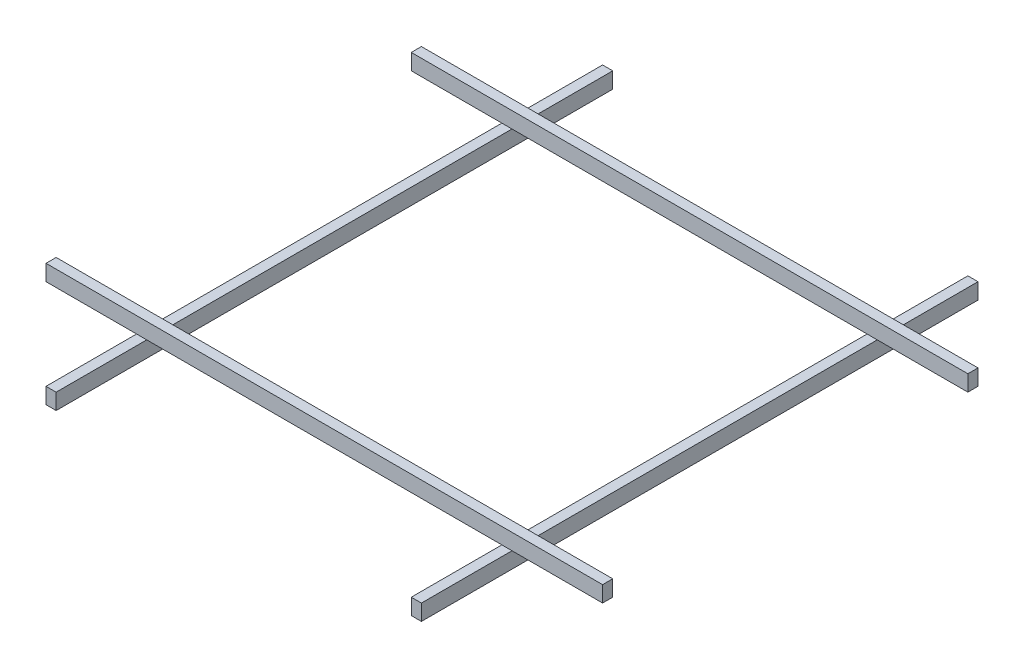
ISO-10303-21;
HEADER;
FILE_DESCRIPTION(('STEP AP214'),'2;1');
FILE_NAME('part.step','',(''),(''),'','','');
FILE_SCHEMA(('AUTOMOTIVE_DESIGN { 1 0 10303 214 1 1 1 1 }'));
ENDSEC;
DATA;
#1=APPLICATION_CONTEXT('core data for automotive mechanical design processes');
#2=APPLICATION_PROTOCOL_DEFINITION('international standard','automotive_design',2000,#1);
#3=PRODUCT_CONTEXT('',#1,'mechanical');
#4=PRODUCT('Part','Part','',(#3));
#5=PRODUCT_RELATED_PRODUCT_CATEGORY('part','',(#4));
#6=PRODUCT_DEFINITION_FORMATION('','',#4);
#7=PRODUCT_DEFINITION_CONTEXT('part definition',#1,'design');
#8=PRODUCT_DEFINITION('design','',#6,#7);
#9=PRODUCT_DEFINITION_SHAPE('','',#8);
#10=(LENGTH_UNIT() NAMED_UNIT(*) SI_UNIT(.MILLI.,.METRE.));
#11=(NAMED_UNIT(*) PLANE_ANGLE_UNIT() SI_UNIT($,.RADIAN.));
#12=(NAMED_UNIT(*) SI_UNIT($,.STERADIAN.) SOLID_ANGLE_UNIT());
#13=UNCERTAINTY_MEASURE_WITH_UNIT(LENGTH_MEASURE(1.E-05),#10,'distance_accuracy_value','');
#14=(GEOMETRIC_REPRESENTATION_CONTEXT(3) GLOBAL_UNCERTAINTY_ASSIGNED_CONTEXT((#13)) GLOBAL_UNIT_ASSIGNED_CONTEXT((#10,
#11,#12)) REPRESENTATION_CONTEXT('',''));
#15=CARTESIAN_POINT('',(0.,0.,0.));
#16=DIRECTION('',(0.,0.,1.));
#17=DIRECTION('',(1.,0.,0.));
#18=AXIS2_PLACEMENT_3D('',#15,#16,#17);
#19=CARTESIAN_POINT('',(4572.,209.55,-882.649999999999));
#20=DIRECTION('',(0.,0.,1.));
#21=DIRECTION('',(1.,0.,0.));
#22=AXIS2_PLACEMENT_3D('',#19,#20,#21);
#23=PLANE('',#22);
#24=DIRECTION('',(0.,1.,0.));
#25=VECTOR('',#24,1.);
#26=CARTESIAN_POINT('',(-304.8,209.55,-882.649999999999));
#27=LINE('',#26,#25);
#28=CARTESIAN_POINT('',(-304.8,69.85,-882.649999999999));
#29=VERTEX_POINT('',#28);
#30=CARTESIAN_POINT('',(-304.8,209.55,-882.649999999999));
#31=VERTEX_POINT('',#30);
#32=EDGE_CURVE('E126',#29,#31,#27,.T.);
#33=ORIENTED_EDGE('',*,*,#32,.T.);
#34=DIRECTION('',(-1.,0.,0.));
#35=VECTOR('',#34,1.);
#36=CARTESIAN_POINT('',(4572.,209.55,-882.649999999999));
#37=LINE('',#36,#35);
#38=CARTESIAN_POINT('',(4572.,209.55,-882.649999999999));
#39=VERTEX_POINT('',#38);
#40=EDGE_CURVE('E13',#39,#31,#37,.T.);
#41=ORIENTED_EDGE('',*,*,#40,.F.);
#42=DIRECTION('',(0.,1.,0.));
#43=VECTOR('',#42,1.);
#44=CARTESIAN_POINT('',(4572.,209.55,-882.649999999999));
#45=LINE('',#44,#43);
#46=CARTESIAN_POINT('',(4572.,69.85,-882.649999999999));
#47=VERTEX_POINT('',#46);
#48=EDGE_CURVE('E114',#47,#39,#45,.T.);
#49=ORIENTED_EDGE('',*,*,#48,.F.);
#50=DIRECTION('',(-1.,0.,0.));
#51=VECTOR('',#50,1.);
#52=CARTESIAN_POINT('',(4572.,69.85,-882.649999999999));
#53=LINE('',#52,#51);
#54=EDGE_CURVE('E122',#47,#29,#53,.T.);
#55=ORIENTED_EDGE('',*,*,#54,.T.);
#56=EDGE_LOOP('',(#33,#41,#49,#55));
#57=FACE_BOUND('',#56,.T.);
#58=ADVANCED_FACE('F63',(#57),#23,.F.);
#59=CARTESIAN_POINT('',(4572.,209.55,-793.749999999999));
#60=DIRECTION('',(0.,-1.,0.));
#61=DIRECTION('',(0.,0.,-1.));
#62=AXIS2_PLACEMENT_3D('',#59,#60,#61);
#63=PLANE('',#62);
#64=DIRECTION('',(0.,0.,1.));
#65=VECTOR('',#64,1.);
#66=CARTESIAN_POINT('',(-304.8,209.55,-793.749999999999));
#67=LINE('',#66,#65);
#68=CARTESIAN_POINT('',(-304.8,209.55,-793.749999999999));
#69=VERTEX_POINT('',#68);
#70=EDGE_CURVE('E118',#31,#69,#67,.T.);
#71=ORIENTED_EDGE('',*,*,#70,.T.);
#72=DIRECTION('',(-1.,0.,0.));
#73=VECTOR('',#72,1.);
#74=CARTESIAN_POINT('',(4572.,209.55,-793.749999999999));
#75=LINE('',#74,#73);
#76=CARTESIAN_POINT('',(4572.,209.55,-793.749999999999));
#77=VERTEX_POINT('',#76);
#78=EDGE_CURVE('E71',#77,#69,#75,.T.);
#79=ORIENTED_EDGE('',*,*,#78,.F.);
#80=DIRECTION('',(0.,0.,1.));
#81=VECTOR('',#80,1.);
#82=CARTESIAN_POINT('',(4572.,209.55,-793.749999999999));
#83=LINE('',#82,#81);
#84=EDGE_CURVE('E109',#39,#77,#83,.T.);
#85=ORIENTED_EDGE('',*,*,#84,.F.);
#86=ORIENTED_EDGE('',*,*,#40,.T.);
#87=EDGE_LOOP('',(#71,#79,#85,#86));
#88=FACE_BOUND('',#87,.T.);
#89=ADVANCED_FACE('F117',(#88),#63,.F.);
#90=CARTESIAN_POINT('',(4572.,209.55,-793.749999999999));
#91=DIRECTION('',(0.,0.,-1.));
#92=DIRECTION('',(-1.,0.,0.));
#93=AXIS2_PLACEMENT_3D('',#90,#91,#92);
#94=PLANE('',#93);
#95=DIRECTION('',(0.,-1.,0.));
#96=VECTOR('',#95,1.);
#97=CARTESIAN_POINT('',(-304.8,209.55,-793.749999999999));
#98=LINE('',#97,#96);
#99=CARTESIAN_POINT('',(-304.8,69.85,-793.749999999999));
#100=VERTEX_POINT('',#99);
#101=EDGE_CURVE('E96',#69,#100,#98,.T.);
#102=ORIENTED_EDGE('',*,*,#101,.T.);
#103=DIRECTION('',(-1.,0.,0.));
#104=VECTOR('',#103,1.);
#105=CARTESIAN_POINT('',(4572.,69.85,-793.749999999999));
#106=LINE('',#105,#104);
#107=CARTESIAN_POINT('',(4572.,69.85,-793.749999999999));
#108=VERTEX_POINT('',#107);
#109=EDGE_CURVE('E119',#108,#100,#106,.T.);
#110=ORIENTED_EDGE('',*,*,#109,.F.);
#111=DIRECTION('',(0.,-1.,0.));
#112=VECTOR('',#111,1.);
#113=CARTESIAN_POINT('',(4572.,209.55,-793.749999999999));
#114=LINE('',#113,#112);
#115=EDGE_CURVE('E112',#77,#108,#114,.T.);
#116=ORIENTED_EDGE('',*,*,#115,.F.);
#117=ORIENTED_EDGE('',*,*,#78,.T.);
#118=EDGE_LOOP('',(#102,#110,#116,#117));
#119=FACE_BOUND('',#118,.T.);
#120=ADVANCED_FACE('F120',(#119),#94,.F.);
#121=CARTESIAN_POINT('',(4572.,69.85,-793.749999999999));
#122=DIRECTION('',(0.,1.,0.));
#123=DIRECTION('',(0.,0.,1.));
#124=AXIS2_PLACEMENT_3D('',#121,#122,#123);
#125=PLANE('',#124);
#126=DIRECTION('',(0.,0.,-1.));
#127=VECTOR('',#126,1.);
#128=CARTESIAN_POINT('',(-304.8,69.85,-793.749999999999));
#129=LINE('',#128,#127);
#130=EDGE_CURVE('E102',#100,#29,#129,.T.);
#131=ORIENTED_EDGE('',*,*,#130,.T.);
#132=ORIENTED_EDGE('',*,*,#54,.F.);
#133=DIRECTION('',(0.,0.,-1.));
#134=VECTOR('',#133,1.);
#135=CARTESIAN_POINT('',(4572.,69.85,-793.749999999999));
#136=LINE('',#135,#134);
#137=EDGE_CURVE('E79',#108,#47,#136,.T.);
#138=ORIENTED_EDGE('',*,*,#137,.F.);
#139=ORIENTED_EDGE('',*,*,#109,.T.);
#140=EDGE_LOOP('',(#131,#132,#138,#139));
#141=FACE_BOUND('',#140,.T.);
#142=ADVANCED_FACE('F133',(#141),#125,.F.);
#143=CARTESIAN_POINT('',(4572.,139.7,-1371.6));
#144=DIRECTION('',(1.,0.,0.));
#145=DIRECTION('',(0.,0.,-1.));
#146=AXIS2_PLACEMENT_3D('',#143,#144,#145);
#147=PLANE('',#146);
#148=ORIENTED_EDGE('',*,*,#48,.T.);
#149=ORIENTED_EDGE('',*,*,#84,.T.);
#150=ORIENTED_EDGE('',*,*,#115,.T.);
#151=ORIENTED_EDGE('',*,*,#137,.T.);
#152=EDGE_LOOP('',(#148,#149,#150,#151));
#153=FACE_BOUND('',#152,.T.);
#154=ADVANCED_FACE('F110',(#153),#147,.T.);
#155=CARTESIAN_POINT('',(-304.8,139.7,-1371.6));
#156=DIRECTION('',(1.,0.,0.));
#157=DIRECTION('',(0.,0.,-1.));
#158=AXIS2_PLACEMENT_3D('',#155,#156,#157);
#159=PLANE('',#158);
#160=ORIENTED_EDGE('',*,*,#32,.F.);
#161=ORIENTED_EDGE('',*,*,#130,.F.);
#162=ORIENTED_EDGE('',*,*,#101,.F.);
#163=ORIENTED_EDGE('',*,*,#70,.F.);
#164=EDGE_LOOP('',(#160,#161,#162,#163));
#165=FACE_BOUND('',#164,.T.);
#166=ADVANCED_FACE('F136',(#165),#159,.F.);
#167=CLOSED_SHELL('',(#58,#89,#120,#142,#154,#166));
#168=MANIFOLD_SOLID_BREP('B2',#167);
#169=CARTESIAN_POINT('',(4572.,209.55,-4083.05));
#170=DIRECTION('',(0.,0.,1.));
#171=DIRECTION('',(1.,0.,0.));
#172=AXIS2_PLACEMENT_3D('',#169,#170,#171);
#173=PLANE('',#172);
#174=DIRECTION('',(0.,1.,0.));
#175=VECTOR('',#174,1.);
#176=CARTESIAN_POINT('',(-304.8,209.55,-4083.05));
#177=LINE('',#176,#175);
#178=CARTESIAN_POINT('',(-304.8,69.85,-4083.05));
#179=VERTEX_POINT('',#178);
#180=CARTESIAN_POINT('',(-304.8,209.55,-4083.05));
#181=VERTEX_POINT('',#180);
#182=EDGE_CURVE('E283',#179,#181,#177,.T.);
#183=ORIENTED_EDGE('',*,*,#182,.T.);
#184=DIRECTION('',(-1.,0.,0.));
#185=VECTOR('',#184,1.);
#186=CARTESIAN_POINT('',(4572.,209.55,-4083.05));
#187=LINE('',#186,#185);
#188=CARTESIAN_POINT('',(4572.,209.55,-4083.05));
#189=VERTEX_POINT('',#188);
#190=EDGE_CURVE('E61',#189,#181,#187,.T.);
#191=ORIENTED_EDGE('',*,*,#190,.F.);
#192=DIRECTION('',(0.,1.,0.));
#193=VECTOR('',#192,1.);
#194=CARTESIAN_POINT('',(4572.,209.55,-4083.05));
#195=LINE('',#194,#193);
#196=CARTESIAN_POINT('',(4572.,69.85,-4083.05));
#197=VERTEX_POINT('',#196);
#198=EDGE_CURVE('E271',#197,#189,#195,.T.);
#199=ORIENTED_EDGE('',*,*,#198,.F.);
#200=DIRECTION('',(-1.,0.,0.));
#201=VECTOR('',#200,1.);
#202=CARTESIAN_POINT('',(4572.,69.85,-4083.05));
#203=LINE('',#202,#201);
#204=EDGE_CURVE('E279',#197,#179,#203,.T.);
#205=ORIENTED_EDGE('',*,*,#204,.T.);
#206=EDGE_LOOP('',(#183,#191,#199,#205));
#207=FACE_BOUND('',#206,.T.);
#208=ADVANCED_FACE('F220',(#207),#173,.F.);
#209=CARTESIAN_POINT('',(4572.,209.55,-3994.15));
#210=DIRECTION('',(0.,-1.,0.));
#211=DIRECTION('',(0.,0.,-1.));
#212=AXIS2_PLACEMENT_3D('',#209,#210,#211);
#213=PLANE('',#212);
#214=DIRECTION('',(0.,0.,1.));
#215=VECTOR('',#214,1.);
#216=CARTESIAN_POINT('',(-304.8,209.55,-3994.15));
#217=LINE('',#216,#215);
#218=CARTESIAN_POINT('',(-304.8,209.55,-3994.15));
#219=VERTEX_POINT('',#218);
#220=EDGE_CURVE('E275',#181,#219,#217,.T.);
#221=ORIENTED_EDGE('',*,*,#220,.T.);
#222=DIRECTION('',(-1.,0.,0.));
#223=VECTOR('',#222,1.);
#224=CARTESIAN_POINT('',(4572.,209.55,-3994.15));
#225=LINE('',#224,#223);
#226=CARTESIAN_POINT('',(4572.,209.55,-3994.15));
#227=VERTEX_POINT('',#226);
#228=EDGE_CURVE('E228',#227,#219,#225,.T.);
#229=ORIENTED_EDGE('',*,*,#228,.F.);
#230=DIRECTION('',(0.,0.,1.));
#231=VECTOR('',#230,1.);
#232=CARTESIAN_POINT('',(4572.,209.55,-3994.15));
#233=LINE('',#232,#231);
#234=EDGE_CURVE('E266',#189,#227,#233,.T.);
#235=ORIENTED_EDGE('',*,*,#234,.F.);
#236=ORIENTED_EDGE('',*,*,#190,.T.);
#237=EDGE_LOOP('',(#221,#229,#235,#236));
#238=FACE_BOUND('',#237,.T.);
#239=ADVANCED_FACE('F274',(#238),#213,.F.);
#240=CARTESIAN_POINT('',(4572.,209.55,-3994.15));
#241=DIRECTION('',(0.,0.,-1.));
#242=DIRECTION('',(-1.,0.,0.));
#243=AXIS2_PLACEMENT_3D('',#240,#241,#242);
#244=PLANE('',#243);
#245=DIRECTION('',(0.,-1.,0.));
#246=VECTOR('',#245,1.);
#247=CARTESIAN_POINT('',(-304.8,209.55,-3994.15));
#248=LINE('',#247,#246);
#249=CARTESIAN_POINT('',(-304.8,69.85,-3994.15));
#250=VERTEX_POINT('',#249);
#251=EDGE_CURVE('E253',#219,#250,#248,.T.);
#252=ORIENTED_EDGE('',*,*,#251,.T.);
#253=DIRECTION('',(-1.,0.,0.));
#254=VECTOR('',#253,1.);
#255=CARTESIAN_POINT('',(4572.,69.85,-3994.15));
#256=LINE('',#255,#254);
#257=CARTESIAN_POINT('',(4572.,69.85,-3994.15));
#258=VERTEX_POINT('',#257);
#259=EDGE_CURVE('E276',#258,#250,#256,.T.);
#260=ORIENTED_EDGE('',*,*,#259,.F.);
#261=DIRECTION('',(0.,-1.,0.));
#262=VECTOR('',#261,1.);
#263=CARTESIAN_POINT('',(4572.,209.55,-3994.15));
#264=LINE('',#263,#262);
#265=EDGE_CURVE('E269',#227,#258,#264,.T.);
#266=ORIENTED_EDGE('',*,*,#265,.F.);
#267=ORIENTED_EDGE('',*,*,#228,.T.);
#268=EDGE_LOOP('',(#252,#260,#266,#267));
#269=FACE_BOUND('',#268,.T.);
#270=ADVANCED_FACE('F277',(#269),#244,.F.);
#271=CARTESIAN_POINT('',(4572.,69.85,-3994.15));
#272=DIRECTION('',(0.,1.,0.));
#273=DIRECTION('',(0.,0.,1.));
#274=AXIS2_PLACEMENT_3D('',#271,#272,#273);
#275=PLANE('',#274);
#276=DIRECTION('',(0.,0.,-1.));
#277=VECTOR('',#276,1.);
#278=CARTESIAN_POINT('',(-304.8,69.85,-3994.15));
#279=LINE('',#278,#277);
#280=EDGE_CURVE('E259',#250,#179,#279,.T.);
#281=ORIENTED_EDGE('',*,*,#280,.T.);
#282=ORIENTED_EDGE('',*,*,#204,.F.);
#283=DIRECTION('',(0.,0.,-1.));
#284=VECTOR('',#283,1.);
#285=CARTESIAN_POINT('',(4572.,69.85,-3994.15));
#286=LINE('',#285,#284);
#287=EDGE_CURVE('E236',#258,#197,#286,.T.);
#288=ORIENTED_EDGE('',*,*,#287,.F.);
#289=ORIENTED_EDGE('',*,*,#259,.T.);
#290=EDGE_LOOP('',(#281,#282,#288,#289));
#291=FACE_BOUND('',#290,.T.);
#292=ADVANCED_FACE('F290',(#291),#275,.F.);
#293=CARTESIAN_POINT('',(4572.,139.7,-4572.));
#294=DIRECTION('',(1.,0.,0.));
#295=DIRECTION('',(0.,0.,-1.));
#296=AXIS2_PLACEMENT_3D('',#293,#294,#295);
#297=PLANE('',#296);
#298=ORIENTED_EDGE('',*,*,#198,.T.);
#299=ORIENTED_EDGE('',*,*,#234,.T.);
#300=ORIENTED_EDGE('',*,*,#265,.T.);
#301=ORIENTED_EDGE('',*,*,#287,.T.);
#302=EDGE_LOOP('',(#298,#299,#300,#301));
#303=FACE_BOUND('',#302,.T.);
#304=ADVANCED_FACE('F267',(#303),#297,.T.);
#305=CARTESIAN_POINT('',(-304.8,139.7,-4572.));
#306=DIRECTION('',(1.,0.,0.));
#307=DIRECTION('',(0.,0.,-1.));
#308=AXIS2_PLACEMENT_3D('',#305,#306,#307);
#309=PLANE('',#308);
#310=ORIENTED_EDGE('',*,*,#182,.F.);
#311=ORIENTED_EDGE('',*,*,#280,.F.);
#312=ORIENTED_EDGE('',*,*,#251,.F.);
#313=ORIENTED_EDGE('',*,*,#220,.F.);
#314=EDGE_LOOP('',(#310,#311,#312,#313));
#315=FACE_BOUND('',#314,.T.);
#316=ADVANCED_FACE('F293',(#315),#309,.F.);
#317=CLOSED_SHELL('',(#208,#239,#270,#292,#304,#316));
#318=MANIFOLD_SOLID_BREP('B7',#317);
#319=CARTESIAN_POINT('',(3689.35,69.85,-4876.8));
#320=DIRECTION('',(1.,0.,0.));
#321=DIRECTION('',(0.,0.,-1.));
#322=AXIS2_PLACEMENT_3D('',#319,#320,#321);
#323=PLANE('',#322);
#324=DIRECTION('',(0.,1.,0.));
#325=VECTOR('',#324,1.);
#326=CARTESIAN_POINT('',(3689.35,69.85,0.));
#327=LINE('',#326,#325);
#328=CARTESIAN_POINT('',(3689.35,-69.85,0.));
#329=VERTEX_POINT('',#328);
#330=CARTESIAN_POINT('',(3689.35,69.85,0.));
#331=VERTEX_POINT('',#330);
#332=EDGE_CURVE('E439',#329,#331,#327,.T.);
#333=ORIENTED_EDGE('',*,*,#332,.T.);
#334=DIRECTION('',(0.,0.,1.));
#335=VECTOR('',#334,1.);
#336=CARTESIAN_POINT('',(3689.35,69.85,-4876.8));
#337=LINE('',#336,#335);
#338=CARTESIAN_POINT('',(3689.35,69.85,-4876.8));
#339=VERTEX_POINT('',#338);
#340=EDGE_CURVE('E218',#339,#331,#337,.T.);
#341=ORIENTED_EDGE('',*,*,#340,.F.);
#342=DIRECTION('',(0.,1.,0.));
#343=VECTOR('',#342,1.);
#344=CARTESIAN_POINT('',(3689.35,69.85,-4876.8));
#345=LINE('',#344,#343);
#346=CARTESIAN_POINT('',(3689.35,-69.85,-4876.8));
#347=VERTEX_POINT('',#346);
#348=EDGE_CURVE('E427',#347,#339,#345,.T.);
#349=ORIENTED_EDGE('',*,*,#348,.F.);
#350=DIRECTION('',(0.,0.,1.));
#351=VECTOR('',#350,1.);
#352=CARTESIAN_POINT('',(3689.35,-69.85,-4876.8));
#353=LINE('',#352,#351);
#354=EDGE_CURVE('E435',#347,#329,#353,.T.);
#355=ORIENTED_EDGE('',*,*,#354,.T.);
#356=EDGE_LOOP('',(#333,#341,#349,#355));
#357=FACE_BOUND('',#356,.T.);
#358=ADVANCED_FACE('F376',(#357),#323,.F.);
#359=CARTESIAN_POINT('',(3778.25,69.85,-4876.8));
#360=DIRECTION('',(0.,-1.,0.));
#361=DIRECTION('',(0.,0.,-1.));
#362=AXIS2_PLACEMENT_3D('',#359,#360,#361);
#363=PLANE('',#362);
#364=DIRECTION('',(1.,0.,0.));
#365=VECTOR('',#364,1.);
#366=CARTESIAN_POINT('',(3778.25,69.85,0.));
#367=LINE('',#366,#365);
#368=CARTESIAN_POINT('',(3778.25,69.85,0.));
#369=VERTEX_POINT('',#368);
#370=EDGE_CURVE('E431',#331,#369,#367,.T.);
#371=ORIENTED_EDGE('',*,*,#370,.T.);
#372=DIRECTION('',(0.,0.,1.));
#373=VECTOR('',#372,1.);
#374=CARTESIAN_POINT('',(3778.25,69.85,-4876.8));
#375=LINE('',#374,#373);
#376=CARTESIAN_POINT('',(3778.25,69.85,-4876.8));
#377=VERTEX_POINT('',#376);
#378=EDGE_CURVE('E384',#377,#369,#375,.T.);
#379=ORIENTED_EDGE('',*,*,#378,.F.);
#380=DIRECTION('',(1.,0.,0.));
#381=VECTOR('',#380,1.);
#382=CARTESIAN_POINT('',(3778.25,69.85,-4876.8));
#383=LINE('',#382,#381);
#384=EDGE_CURVE('E422',#339,#377,#383,.T.);
#385=ORIENTED_EDGE('',*,*,#384,.F.);
#386=ORIENTED_EDGE('',*,*,#340,.T.);
#387=EDGE_LOOP('',(#371,#379,#385,#386));
#388=FACE_BOUND('',#387,.T.);
#389=ADVANCED_FACE('F430',(#388),#363,.F.);
#390=CARTESIAN_POINT('',(3778.25,69.85,-4876.8));
#391=DIRECTION('',(-1.,0.,0.));
#392=DIRECTION('',(0.,0.,1.));
#393=AXIS2_PLACEMENT_3D('',#390,#391,#392);
#394=PLANE('',#393);
#395=DIRECTION('',(0.,-1.,0.));
#396=VECTOR('',#395,1.);
#397=CARTESIAN_POINT('',(3778.25,69.85,0.));
#398=LINE('',#397,#396);
#399=CARTESIAN_POINT('',(3778.25,-69.85,0.));
#400=VERTEX_POINT('',#399);
#401=EDGE_CURVE('E409',#369,#400,#398,.T.);
#402=ORIENTED_EDGE('',*,*,#401,.T.);
#403=DIRECTION('',(0.,0.,1.));
#404=VECTOR('',#403,1.);
#405=CARTESIAN_POINT('',(3778.25,-69.85,-4876.8));
#406=LINE('',#405,#404);
#407=CARTESIAN_POINT('',(3778.25,-69.85,-4876.8));
#408=VERTEX_POINT('',#407);
#409=EDGE_CURVE('E432',#408,#400,#406,.T.);
#410=ORIENTED_EDGE('',*,*,#409,.F.);
#411=DIRECTION('',(0.,-1.,0.));
#412=VECTOR('',#411,1.);
#413=CARTESIAN_POINT('',(3778.25,69.85,-4876.8));
#414=LINE('',#413,#412);
#415=EDGE_CURVE('E425',#377,#408,#414,.T.);
#416=ORIENTED_EDGE('',*,*,#415,.F.);
#417=ORIENTED_EDGE('',*,*,#378,.T.);
#418=EDGE_LOOP('',(#402,#410,#416,#417));
#419=FACE_BOUND('',#418,.T.);
#420=ADVANCED_FACE('F433',(#419),#394,.F.);
#421=CARTESIAN_POINT('',(3778.25,-69.85,-4876.8));
#422=DIRECTION('',(0.,1.,0.));
#423=DIRECTION('',(0.,0.,1.));
#424=AXIS2_PLACEMENT_3D('',#421,#422,#423);
#425=PLANE('',#424);
#426=DIRECTION('',(-1.,0.,0.));
#427=VECTOR('',#426,1.);
#428=CARTESIAN_POINT('',(3778.25,-69.85,0.));
#429=LINE('',#428,#427);
#430=EDGE_CURVE('E415',#400,#329,#429,.T.);
#431=ORIENTED_EDGE('',*,*,#430,.T.);
#432=ORIENTED_EDGE('',*,*,#354,.F.);
#433=DIRECTION('',(-1.,0.,0.));
#434=VECTOR('',#433,1.);
#435=CARTESIAN_POINT('',(3778.25,-69.85,-4876.8));
#436=LINE('',#435,#434);
#437=EDGE_CURVE('E392',#408,#347,#436,.T.);
#438=ORIENTED_EDGE('',*,*,#437,.F.);
#439=ORIENTED_EDGE('',*,*,#409,.T.);
#440=EDGE_LOOP('',(#431,#432,#438,#439));
#441=FACE_BOUND('',#440,.T.);
#442=ADVANCED_FACE('F446',(#441),#425,.F.);
#443=CARTESIAN_POINT('',(3200.4,0.,-4876.8));
#444=DIRECTION('',(0.,0.,-1.));
#445=DIRECTION('',(-1.,0.,0.));
#446=AXIS2_PLACEMENT_3D('',#443,#444,#445);
#447=PLANE('',#446);
#448=ORIENTED_EDGE('',*,*,#348,.T.);
#449=ORIENTED_EDGE('',*,*,#384,.T.);
#450=ORIENTED_EDGE('',*,*,#415,.T.);
#451=ORIENTED_EDGE('',*,*,#437,.T.);
#452=EDGE_LOOP('',(#448,#449,#450,#451));
#453=FACE_BOUND('',#452,.T.);
#454=ADVANCED_FACE('F423',(#453),#447,.T.);
#455=CARTESIAN_POINT('',(3200.4,0.,0.));
#456=DIRECTION('',(0.,0.,-1.));
#457=DIRECTION('',(-1.,0.,0.));
#458=AXIS2_PLACEMENT_3D('',#455,#456,#457);
#459=PLANE('',#458);
#460=ORIENTED_EDGE('',*,*,#332,.F.);
#461=ORIENTED_EDGE('',*,*,#430,.F.);
#462=ORIENTED_EDGE('',*,*,#401,.F.);
#463=ORIENTED_EDGE('',*,*,#370,.F.);
#464=EDGE_LOOP('',(#460,#461,#462,#463));
#465=FACE_BOUND('',#464,.T.);
#466=ADVANCED_FACE('F449',(#465),#459,.F.);
#467=CLOSED_SHELL('',(#358,#389,#420,#442,#454,#466));
#468=MANIFOLD_SOLID_BREP('B55',#467);
#469=CARTESIAN_POINT('',(488.95,69.85,-4876.8));
#470=DIRECTION('',(1.,0.,0.));
#471=DIRECTION('',(0.,0.,-1.));
#472=AXIS2_PLACEMENT_3D('',#469,#470,#471);
#473=PLANE('',#472);
#474=DIRECTION('',(0.,1.,0.));
#475=VECTOR('',#474,1.);
#476=CARTESIAN_POINT('',(488.95,69.85,8.88178419700125E-13));
#477=LINE('',#476,#475);
#478=CARTESIAN_POINT('',(488.95,-69.85,8.88178419700125E-13));
#479=VERTEX_POINT('',#478);
#480=CARTESIAN_POINT('',(488.95,69.85,8.88178419700125E-13));
#481=VERTEX_POINT('',#480);
#482=EDGE_CURVE('E586',#479,#481,#477,.T.);
#483=ORIENTED_EDGE('',*,*,#482,.T.);
#484=DIRECTION('',(0.,0.,1.));
#485=VECTOR('',#484,1.);
#486=CARTESIAN_POINT('',(488.95,69.85,-4876.8));
#487=LINE('',#486,#485);
#488=CARTESIAN_POINT('',(488.95,69.85,-4876.8));
#489=VERTEX_POINT('',#488);
#490=EDGE_CURVE('E374',#489,#481,#487,.T.);
#491=ORIENTED_EDGE('',*,*,#490,.F.);
#492=DIRECTION('',(0.,1.,0.));
#493=VECTOR('',#492,1.);
#494=CARTESIAN_POINT('',(488.95,69.85,-4876.8));
#495=LINE('',#494,#493);
#496=CARTESIAN_POINT('',(488.95,-69.85,-4876.8));
#497=VERTEX_POINT('',#496);
#498=EDGE_CURVE('E574',#497,#489,#495,.T.);
#499=ORIENTED_EDGE('',*,*,#498,.F.);
#500=DIRECTION('',(0.,0.,1.));
#501=VECTOR('',#500,1.);
#502=CARTESIAN_POINT('',(488.95,-69.85,-4876.8));
#503=LINE('',#502,#501);
#504=EDGE_CURVE('E582',#497,#479,#503,.T.);
#505=ORIENTED_EDGE('',*,*,#504,.T.);
#506=EDGE_LOOP('',(#483,#491,#499,#505));
#507=FACE_BOUND('',#506,.T.);
#508=ADVANCED_FACE('F523',(#507),#473,.F.);
#509=CARTESIAN_POINT('',(577.85,69.85,-4876.8));
#510=DIRECTION('',(0.,-1.,0.));
#511=DIRECTION('',(0.,0.,-1.));
#512=AXIS2_PLACEMENT_3D('',#509,#510,#511);
#513=PLANE('',#512);
#514=DIRECTION('',(1.,0.,0.));
#515=VECTOR('',#514,1.);
#516=CARTESIAN_POINT('',(577.85,69.85,8.88178419700125E-13));
#517=LINE('',#516,#515);
#518=CARTESIAN_POINT('',(577.85,69.85,8.88178419700125E-13));
#519=VERTEX_POINT('',#518);
#520=EDGE_CURVE('E578',#481,#519,#517,.T.);
#521=ORIENTED_EDGE('',*,*,#520,.T.);
#522=DIRECTION('',(0.,0.,1.));
#523=VECTOR('',#522,1.);
#524=CARTESIAN_POINT('',(577.85,69.85,-4876.8));
#525=LINE('',#524,#523);
#526=CARTESIAN_POINT('',(577.85,69.85,-4876.8));
#527=VERTEX_POINT('',#526);
#528=EDGE_CURVE('E531',#527,#519,#525,.T.);
#529=ORIENTED_EDGE('',*,*,#528,.F.);
#530=DIRECTION('',(1.,0.,0.));
#531=VECTOR('',#530,1.);
#532=CARTESIAN_POINT('',(577.85,69.85,-4876.8));
#533=LINE('',#532,#531);
#534=EDGE_CURVE('E569',#489,#527,#533,.T.);
#535=ORIENTED_EDGE('',*,*,#534,.F.);
#536=ORIENTED_EDGE('',*,*,#490,.T.);
#537=EDGE_LOOP('',(#521,#529,#535,#536));
#538=FACE_BOUND('',#537,.T.);
#539=ADVANCED_FACE('F577',(#538),#513,.F.);
#540=CARTESIAN_POINT('',(577.85,69.85,-4876.8));
#541=DIRECTION('',(-1.,0.,0.));
#542=DIRECTION('',(0.,0.,1.));
#543=AXIS2_PLACEMENT_3D('',#540,#541,#542);
#544=PLANE('',#543);
#545=DIRECTION('',(0.,-1.,0.));
#546=VECTOR('',#545,1.);
#547=CARTESIAN_POINT('',(577.85,69.85,8.88178419700125E-13));
#548=LINE('',#547,#546);
#549=CARTESIAN_POINT('',(577.85,-69.85,8.88178419700125E-13));
#550=VERTEX_POINT('',#549);
#551=EDGE_CURVE('E556',#519,#550,#548,.T.);
#552=ORIENTED_EDGE('',*,*,#551,.T.);
#553=DIRECTION('',(0.,0.,1.));
#554=VECTOR('',#553,1.);
#555=CARTESIAN_POINT('',(577.85,-69.85,-4876.8));
#556=LINE('',#555,#554);
#557=CARTESIAN_POINT('',(577.85,-69.85,-4876.8));
#558=VERTEX_POINT('',#557);
#559=EDGE_CURVE('E579',#558,#550,#556,.T.);
#560=ORIENTED_EDGE('',*,*,#559,.F.);
#561=DIRECTION('',(0.,-1.,0.));
#562=VECTOR('',#561,1.);
#563=CARTESIAN_POINT('',(577.85,69.85,-4876.8));
#564=LINE('',#563,#562);
#565=EDGE_CURVE('E572',#527,#558,#564,.T.);
#566=ORIENTED_EDGE('',*,*,#565,.F.);
#567=ORIENTED_EDGE('',*,*,#528,.T.);
#568=EDGE_LOOP('',(#552,#560,#566,#567));
#569=FACE_BOUND('',#568,.T.);
#570=ADVANCED_FACE('F580',(#569),#544,.F.);
#571=CARTESIAN_POINT('',(577.85,-69.85,-4876.8));
#572=DIRECTION('',(0.,1.,0.));
#573=DIRECTION('',(0.,0.,1.));
#574=AXIS2_PLACEMENT_3D('',#571,#572,#573);
#575=PLANE('',#574);
#576=DIRECTION('',(-1.,0.,0.));
#577=VECTOR('',#576,1.);
#578=CARTESIAN_POINT('',(577.85,-69.85,8.88178419700125E-13));
#579=LINE('',#578,#577);
#580=EDGE_CURVE('E562',#550,#479,#579,.T.);
#581=ORIENTED_EDGE('',*,*,#580,.T.);
#582=ORIENTED_EDGE('',*,*,#504,.F.);
#583=DIRECTION('',(-1.,0.,0.));
#584=VECTOR('',#583,1.);
#585=CARTESIAN_POINT('',(577.85,-69.85,-4876.8));
#586=LINE('',#585,#584);
#587=EDGE_CURVE('E539',#558,#497,#586,.T.);
#588=ORIENTED_EDGE('',*,*,#587,.F.);
#589=ORIENTED_EDGE('',*,*,#559,.T.);
#590=EDGE_LOOP('',(#581,#582,#588,#589));
#591=FACE_BOUND('',#590,.T.);
#592=ADVANCED_FACE('F593',(#591),#575,.F.);
#593=CARTESIAN_POINT('',(0.,0.,-4876.8));
#594=DIRECTION('',(0.,0.,-1.));
#595=DIRECTION('',(-1.,0.,0.));
#596=AXIS2_PLACEMENT_3D('',#593,#594,#595);
#597=PLANE('',#596);
#598=ORIENTED_EDGE('',*,*,#498,.T.);
#599=ORIENTED_EDGE('',*,*,#534,.T.);
#600=ORIENTED_EDGE('',*,*,#565,.T.);
#601=ORIENTED_EDGE('',*,*,#587,.T.);
#602=EDGE_LOOP('',(#598,#599,#600,#601));
#603=FACE_BOUND('',#602,.T.);
#604=ADVANCED_FACE('F570',(#603),#597,.T.);
#605=CARTESIAN_POINT('',(0.,0.,8.88178419700125E-13));
#606=DIRECTION('',(0.,0.,-1.));
#607=DIRECTION('',(-1.,0.,0.));
#608=AXIS2_PLACEMENT_3D('',#605,#606,#607);
#609=PLANE('',#608);
#610=ORIENTED_EDGE('',*,*,#482,.F.);
#611=ORIENTED_EDGE('',*,*,#580,.F.);
#612=ORIENTED_EDGE('',*,*,#551,.F.);
#613=ORIENTED_EDGE('',*,*,#520,.F.);
#614=EDGE_LOOP('',(#610,#611,#612,#613));
#615=FACE_BOUND('',#614,.T.);
#616=ADVANCED_FACE('F596',(#615),#609,.F.);
#617=CLOSED_SHELL('',(#508,#539,#570,#592,#604,#616));
#618=MANIFOLD_SOLID_BREP('B212',#617);
#619=ADVANCED_BREP_SHAPE_REPRESENTATION('',(#18,#168,#318,#468,#618),#14);
#620=SHAPE_DEFINITION_REPRESENTATION(#9,#619);
ENDSEC;
END-ISO-10303-21;
